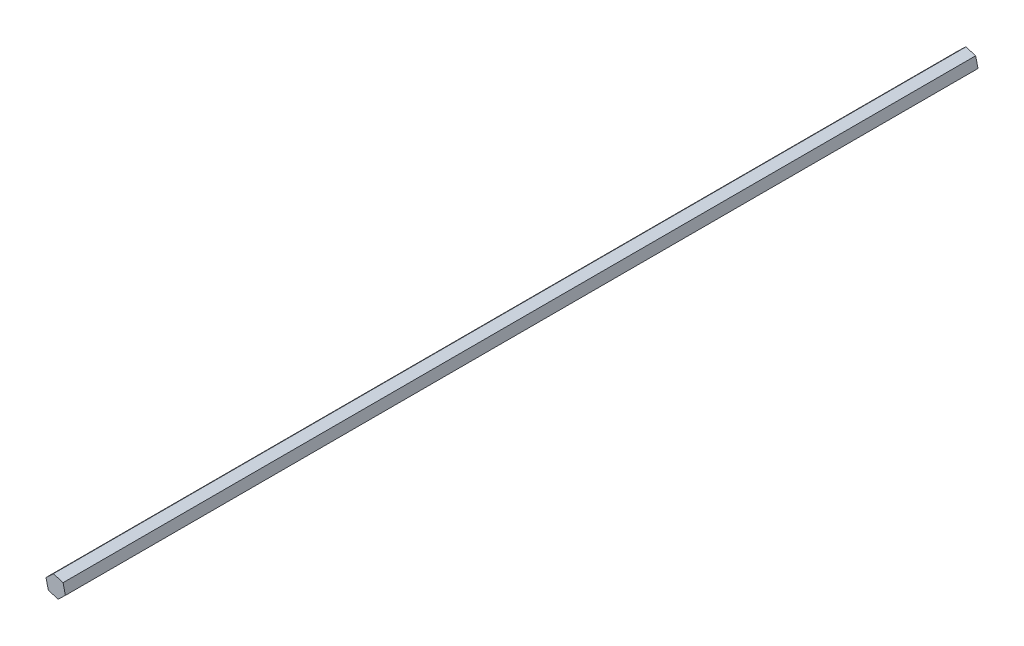
ISO-10303-21;
HEADER;
FILE_DESCRIPTION(('STEP AP214'),'2;1');
FILE_NAME('part.step','',(''),(''),'','','');
FILE_SCHEMA(('AUTOMOTIVE_DESIGN { 1 0 10303 214 1 1 1 1 }'));
ENDSEC;
DATA;
#1=APPLICATION_CONTEXT('core data for automotive mechanical design processes');
#2=APPLICATION_PROTOCOL_DEFINITION('international standard','automotive_design',2000,#1);
#3=PRODUCT_CONTEXT('',#1,'mechanical');
#4=PRODUCT('Part','Part','',(#3));
#5=PRODUCT_RELATED_PRODUCT_CATEGORY('part','',(#4));
#6=PRODUCT_DEFINITION_FORMATION('','',#4);
#7=PRODUCT_DEFINITION_CONTEXT('part definition',#1,'design');
#8=PRODUCT_DEFINITION('design','',#6,#7);
#9=PRODUCT_DEFINITION_SHAPE('','',#8);
#10=(LENGTH_UNIT() NAMED_UNIT(*) SI_UNIT(.MILLI.,.METRE.));
#11=(NAMED_UNIT(*) PLANE_ANGLE_UNIT() SI_UNIT($,.RADIAN.));
#12=(NAMED_UNIT(*) SI_UNIT($,.STERADIAN.) SOLID_ANGLE_UNIT());
#13=UNCERTAINTY_MEASURE_WITH_UNIT(LENGTH_MEASURE(1.E-05),#10,'distance_accuracy_value','');
#14=(GEOMETRIC_REPRESENTATION_CONTEXT(3) GLOBAL_UNCERTAINTY_ASSIGNED_CONTEXT((#13)) GLOBAL_UNIT_ASSIGNED_CONTEXT((#10,
#11,#12)) REPRESENTATION_CONTEXT('',''));
#15=CARTESIAN_POINT('',(0.,0.,0.));
#16=DIRECTION('',(0.,0.,1.));
#17=DIRECTION('',(1.,0.,0.));
#18=AXIS2_PLACEMENT_3D('',#15,#16,#17);
#19=CARTESIAN_POINT('',(1.69838735130987,-7.13293864674616,660.4));
#20=DIRECTION('',(-0.686998984148245,0.726658376253436,0.));
#21=DIRECTION('',(-0.726658376253436,-0.686998984148245,0.));
#22=AXIS2_PLACEMENT_3D('',#19,#20,#21);
#23=PLANE('',#22);
#24=DIRECTION('',(0.726658376253436,0.686998984148245,0.));
#25=VECTOR('',#24,1.);
#26=CARTESIAN_POINT('',(1.69838735130987,-7.13293864674616,0.));
#27=LINE('',#26,#25);
#28=CARTESIAN_POINT('',(1.69838735130987,-7.13293864674616,0.));
#29=VERTEX_POINT('',#28);
#30=CARTESIAN_POINT('',(7.02649974737291,-2.09562273167256,0.));
#31=VERTEX_POINT('',#30);
#32=EDGE_CURVE('E117',#29,#31,#27,.T.);
#33=ORIENTED_EDGE('',*,*,#32,.T.);
#34=DIRECTION('',(0.,0.,-1.));
#35=VECTOR('',#34,1.);
#36=CARTESIAN_POINT('',(7.02649974737291,-2.09562273167256,660.4));
#37=LINE('',#36,#35);
#38=CARTESIAN_POINT('',(7.02649974737291,-2.09562273167256,660.4));
#39=VERTEX_POINT('',#38);
#40=EDGE_CURVE('E11',#39,#31,#37,.T.);
#41=ORIENTED_EDGE('',*,*,#40,.F.);
#42=DIRECTION('',(0.726658376253436,0.686998984148245,0.));
#43=VECTOR('',#42,1.);
#44=CARTESIAN_POINT('',(1.69838735130987,-7.13293864674616,660.4));
#45=LINE('',#44,#43);
#46=CARTESIAN_POINT('',(1.69838735130987,-7.13293864674616,660.4));
#47=VERTEX_POINT('',#46);
#48=EDGE_CURVE('E127',#47,#39,#45,.T.);
#49=ORIENTED_EDGE('',*,*,#48,.F.);
#50=DIRECTION('',(0.,0.,-1.));
#51=VECTOR('',#50,1.);
#52=CARTESIAN_POINT('',(1.69838735130987,-7.13293864674616,660.4));
#53=LINE('',#52,#51);
#54=EDGE_CURVE('E113',#47,#29,#53,.T.);
#55=ORIENTED_EDGE('',*,*,#54,.T.);
#56=EDGE_LOOP('',(#33,#41,#49,#55));
#57=FACE_BOUND('',#56,.T.);
#58=ADVANCED_FACE('F33',(#57),#23,.F.);
#59=CARTESIAN_POINT('',(7.02649974737291,-2.09562273167256,660.4));
#60=DIRECTION('',(-0.972804105782349,-0.231629384519765,0.));
#61=DIRECTION('',(0.231629384519765,-0.972804105782349,0.));
#62=AXIS2_PLACEMENT_3D('',#59,#60,#61);
#63=PLANE('',#62);
#64=DIRECTION('',(-0.231629384519765,0.972804105782349,0.));
#65=VECTOR('',#64,1.);
#66=CARTESIAN_POINT('',(7.02649974737291,-2.09562273167256,0.));
#67=LINE('',#66,#65);
#68=CARTESIAN_POINT('',(5.32811239606303,5.03731591507361,0.));
#69=VERTEX_POINT('',#68);
#70=EDGE_CURVE('E120',#31,#69,#67,.T.);
#71=ORIENTED_EDGE('',*,*,#70,.T.);
#72=DIRECTION('',(0.,0.,-1.));
#73=VECTOR('',#72,1.);
#74=CARTESIAN_POINT('',(5.32811239606303,5.03731591507361,660.4));
#75=LINE('',#74,#73);
#76=CARTESIAN_POINT('',(5.32811239606303,5.03731591507361,660.4));
#77=VERTEX_POINT('',#76);
#78=EDGE_CURVE('E41',#77,#69,#75,.T.);
#79=ORIENTED_EDGE('',*,*,#78,.F.);
#80=DIRECTION('',(-0.231629384519765,0.972804105782349,0.));
#81=VECTOR('',#80,1.);
#82=CARTESIAN_POINT('',(7.02649974737291,-2.09562273167256,660.4));
#83=LINE('',#82,#81);
#84=EDGE_CURVE('E86',#39,#77,#83,.T.);
#85=ORIENTED_EDGE('',*,*,#84,.F.);
#86=ORIENTED_EDGE('',*,*,#40,.T.);
#87=EDGE_LOOP('',(#71,#79,#85,#86));
#88=FACE_BOUND('',#87,.T.);
#89=ADVANCED_FACE('F151',(#88),#63,.F.);
#90=CARTESIAN_POINT('',(5.32811239606303,5.03731591507361,660.4));
#91=DIRECTION('',(-0.285805121634104,-0.958287760773201,0.));
#92=DIRECTION('',(0.958287760773201,-0.285805121634104,0.));
#93=AXIS2_PLACEMENT_3D('',#90,#91,#92);
#94=PLANE('',#93);
#95=DIRECTION('',(-0.958287760773201,0.285805121634104,0.));
#96=VECTOR('',#95,1.);
#97=CARTESIAN_POINT('',(5.32811239606303,5.03731591507361,0.));
#98=LINE('',#97,#96);
#99=CARTESIAN_POINT('',(-1.69838735130987,7.13293864674617,0.));
#100=VERTEX_POINT('',#99);
#101=EDGE_CURVE('E122',#69,#100,#98,.T.);
#102=ORIENTED_EDGE('',*,*,#101,.T.);
#103=DIRECTION('',(0.,0.,-1.));
#104=VECTOR('',#103,1.);
#105=CARTESIAN_POINT('',(-1.69838735130987,7.13293864674617,660.4));
#106=LINE('',#105,#104);
#107=CARTESIAN_POINT('',(-1.69838735130987,7.13293864674617,660.4));
#108=VERTEX_POINT('',#107);
#109=EDGE_CURVE('E108',#108,#100,#106,.T.);
#110=ORIENTED_EDGE('',*,*,#109,.F.);
#111=DIRECTION('',(-0.958287760773201,0.285805121634104,0.));
#112=VECTOR('',#111,1.);
#113=CARTESIAN_POINT('',(5.32811239606303,5.03731591507361,660.4));
#114=LINE('',#113,#112);
#115=EDGE_CURVE('E99',#77,#108,#114,.T.);
#116=ORIENTED_EDGE('',*,*,#115,.F.);
#117=ORIENTED_EDGE('',*,*,#78,.T.);
#118=EDGE_LOOP('',(#102,#110,#116,#117));
#119=FACE_BOUND('',#118,.T.);
#120=ADVANCED_FACE('F133',(#119),#94,.F.);
#121=CARTESIAN_POINT('',(-1.69838735130987,7.13293864674617,660.4));
#122=DIRECTION('',(0.686998984148245,-0.726658376253436,0.));
#123=DIRECTION('',(0.726658376253436,0.686998984148245,0.));
#124=AXIS2_PLACEMENT_3D('',#121,#122,#123);
#125=PLANE('',#124);
#126=DIRECTION('',(-0.726658376253436,-0.686998984148245,0.));
#127=VECTOR('',#126,1.);
#128=CARTESIAN_POINT('',(-1.69838735130987,7.13293864674617,0.));
#129=LINE('',#128,#127);
#130=CARTESIAN_POINT('',(-7.02649974737291,2.09562273167256,0.));
#131=VERTEX_POINT('',#130);
#132=EDGE_CURVE('E107',#100,#131,#129,.T.);
#133=ORIENTED_EDGE('',*,*,#132,.T.);
#134=DIRECTION('',(0.,0.,-1.));
#135=VECTOR('',#134,1.);
#136=CARTESIAN_POINT('',(-7.02649974737291,2.09562273167256,660.4));
#137=LINE('',#136,#135);
#138=CARTESIAN_POINT('',(-7.02649974737291,2.09562273167256,660.4));
#139=VERTEX_POINT('',#138);
#140=EDGE_CURVE('E104',#139,#131,#137,.T.);
#141=ORIENTED_EDGE('',*,*,#140,.F.);
#142=DIRECTION('',(-0.726658376253436,-0.686998984148245,0.));
#143=VECTOR('',#142,1.);
#144=CARTESIAN_POINT('',(-1.69838735130987,7.13293864674617,660.4));
#145=LINE('',#144,#143);
#146=EDGE_CURVE('E93',#108,#139,#145,.T.);
#147=ORIENTED_EDGE('',*,*,#146,.F.);
#148=ORIENTED_EDGE('',*,*,#109,.T.);
#149=EDGE_LOOP('',(#133,#141,#147,#148));
#150=FACE_BOUND('',#149,.T.);
#151=ADVANCED_FACE('F105',(#150),#125,.F.);
#152=CARTESIAN_POINT('',(-7.02649974737291,2.09562273167256,660.4));
#153=DIRECTION('',(0.972804105782349,0.231629384519764,0.));
#154=DIRECTION('',(-0.231629384519764,0.972804105782349,0.));
#155=AXIS2_PLACEMENT_3D('',#152,#153,#154);
#156=PLANE('',#155);
#157=DIRECTION('',(0.231629384519764,-0.972804105782349,0.));
#158=VECTOR('',#157,1.);
#159=CARTESIAN_POINT('',(-7.02649974737291,2.09562273167256,0.));
#160=LINE('',#159,#158);
#161=CARTESIAN_POINT('',(-5.32811239606304,-5.0373159150736,0.));
#162=VERTEX_POINT('',#161);
#163=EDGE_CURVE('E72',#131,#162,#160,.T.);
#164=ORIENTED_EDGE('',*,*,#163,.T.);
#165=DIRECTION('',(0.,0.,-1.));
#166=VECTOR('',#165,1.);
#167=CARTESIAN_POINT('',(-5.32811239606304,-5.0373159150736,660.4));
#168=LINE('',#167,#166);
#169=CARTESIAN_POINT('',(-5.32811239606304,-5.0373159150736,660.4));
#170=VERTEX_POINT('',#169);
#171=EDGE_CURVE('E109',#170,#162,#168,.T.);
#172=ORIENTED_EDGE('',*,*,#171,.F.);
#173=DIRECTION('',(0.231629384519764,-0.972804105782349,0.));
#174=VECTOR('',#173,1.);
#175=CARTESIAN_POINT('',(-7.02649974737291,2.09562273167256,660.4));
#176=LINE('',#175,#174);
#177=EDGE_CURVE('E97',#139,#170,#176,.T.);
#178=ORIENTED_EDGE('',*,*,#177,.F.);
#179=ORIENTED_EDGE('',*,*,#140,.T.);
#180=EDGE_LOOP('',(#164,#172,#178,#179));
#181=FACE_BOUND('',#180,.T.);
#182=ADVANCED_FACE('F111',(#181),#156,.F.);
#183=CARTESIAN_POINT('',(-5.32811239606304,-5.0373159150736,660.4));
#184=DIRECTION('',(0.285805121634104,0.958287760773201,0.));
#185=DIRECTION('',(-0.958287760773201,0.285805121634104,0.));
#186=AXIS2_PLACEMENT_3D('',#183,#184,#185);
#187=PLANE('',#186);
#188=DIRECTION('',(0.958287760773201,-0.285805121634104,0.));
#189=VECTOR('',#188,1.);
#190=CARTESIAN_POINT('',(-5.32811239606304,-5.0373159150736,0.));
#191=LINE('',#190,#189);
#192=EDGE_CURVE('E78',#162,#29,#191,.T.);
#193=ORIENTED_EDGE('',*,*,#192,.T.);
#194=ORIENTED_EDGE('',*,*,#54,.F.);
#195=DIRECTION('',(0.958287760773201,-0.285805121634104,0.));
#196=VECTOR('',#195,1.);
#197=CARTESIAN_POINT('',(-5.32811239606304,-5.0373159150736,660.4));
#198=LINE('',#197,#196);
#199=EDGE_CURVE('E49',#170,#47,#198,.T.);
#200=ORIENTED_EDGE('',*,*,#199,.F.);
#201=ORIENTED_EDGE('',*,*,#171,.T.);
#202=EDGE_LOOP('',(#193,#194,#200,#201));
#203=FACE_BOUND('',#202,.T.);
#204=ADVANCED_FACE('F140',(#203),#187,.F.);
#205=CARTESIAN_POINT('',(0.,0.,660.4));
#206=DIRECTION('',(0.,0.,1.));
#207=DIRECTION('',(1.,0.,0.));
#208=AXIS2_PLACEMENT_3D('',#205,#206,#207);
#209=PLANE('',#208);
#210=ORIENTED_EDGE('',*,*,#48,.T.);
#211=ORIENTED_EDGE('',*,*,#84,.T.);
#212=ORIENTED_EDGE('',*,*,#115,.T.);
#213=ORIENTED_EDGE('',*,*,#146,.T.);
#214=ORIENTED_EDGE('',*,*,#177,.T.);
#215=ORIENTED_EDGE('',*,*,#199,.T.);
#216=EDGE_LOOP('',(#210,#211,#212,#213,#214,#215));
#217=FACE_BOUND('',#216,.T.);
#218=ADVANCED_FACE('F95',(#217),#209,.T.);
#219=CARTESIAN_POINT('',(0.,0.,0.));
#220=DIRECTION('',(0.,0.,1.));
#221=DIRECTION('',(1.,0.,0.));
#222=AXIS2_PLACEMENT_3D('',#219,#220,#221);
#223=PLANE('',#222);
#224=ORIENTED_EDGE('',*,*,#32,.F.);
#225=ORIENTED_EDGE('',*,*,#192,.F.);
#226=ORIENTED_EDGE('',*,*,#163,.F.);
#227=ORIENTED_EDGE('',*,*,#132,.F.);
#228=ORIENTED_EDGE('',*,*,#101,.F.);
#229=ORIENTED_EDGE('',*,*,#70,.F.);
#230=EDGE_LOOP('',(#224,#225,#226,#227,#228,#229));
#231=FACE_BOUND('',#230,.T.);
#232=ADVANCED_FACE('F136',(#231),#223,.F.);
#233=CLOSED_SHELL('',(#58,#89,#120,#151,#182,#204,#218,#232));
#234=MANIFOLD_SOLID_BREP('B2',#233);
#235=ADVANCED_BREP_SHAPE_REPRESENTATION('',(#18,#234),#14);
#236=SHAPE_DEFINITION_REPRESENTATION(#9,#235);
ENDSEC;
END-ISO-10303-21;
